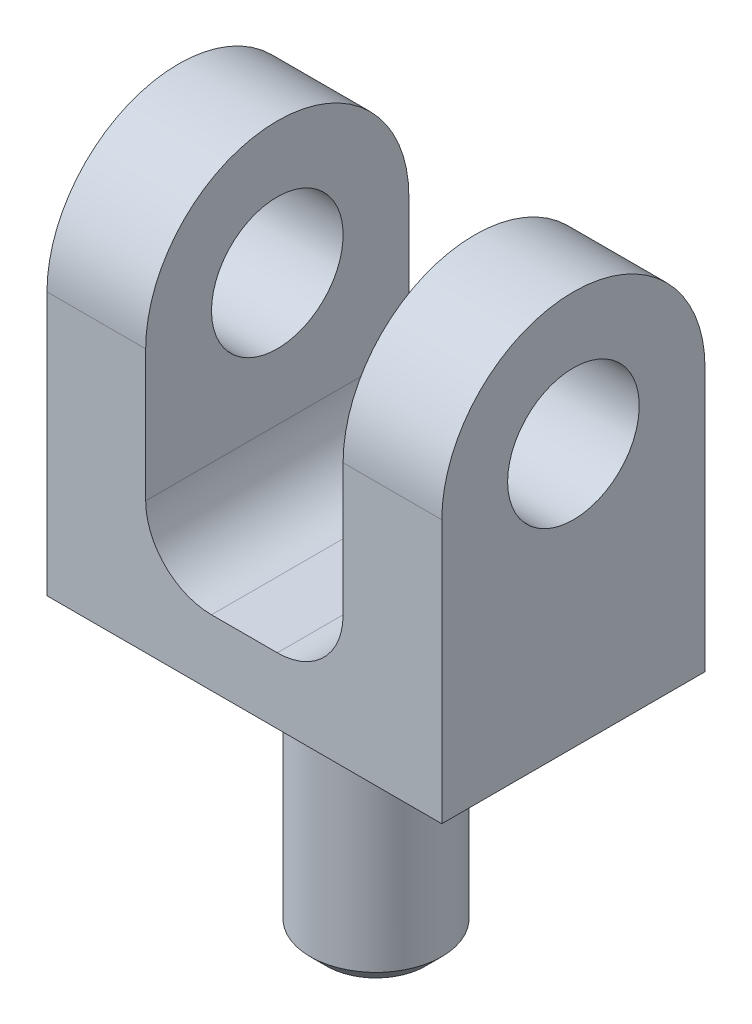
ISO-10303-21;
HEADER;
FILE_DESCRIPTION(('STEP AP214'),'2;1');
FILE_NAME('part.step','',(''),(''),'','','');
FILE_SCHEMA(('AUTOMOTIVE_DESIGN { 1 0 10303 214 1 1 1 1 }'));
ENDSEC;
DATA;
#1=APPLICATION_CONTEXT('core data for automotive mechanical design processes');
#2=APPLICATION_PROTOCOL_DEFINITION('international standard','automotive_design',2000,#1);
#3=PRODUCT_CONTEXT('',#1,'mechanical');
#4=PRODUCT('Part','Part','',(#3));
#5=PRODUCT_RELATED_PRODUCT_CATEGORY('part','',(#4));
#6=PRODUCT_DEFINITION_FORMATION('','',#4);
#7=PRODUCT_DEFINITION_CONTEXT('part definition',#1,'design');
#8=PRODUCT_DEFINITION('design','',#6,#7);
#9=PRODUCT_DEFINITION_SHAPE('','',#8);
#10=(LENGTH_UNIT() NAMED_UNIT(*) SI_UNIT(.MILLI.,.METRE.));
#11=(NAMED_UNIT(*) PLANE_ANGLE_UNIT() SI_UNIT($,.RADIAN.));
#12=(NAMED_UNIT(*) SI_UNIT($,.STERADIAN.) SOLID_ANGLE_UNIT());
#13=UNCERTAINTY_MEASURE_WITH_UNIT(LENGTH_MEASURE(1.E-05),#10,'distance_accuracy_value','');
#14=(GEOMETRIC_REPRESENTATION_CONTEXT(3) GLOBAL_UNCERTAINTY_ASSIGNED_CONTEXT((#13)) GLOBAL_UNIT_ASSIGNED_CONTEXT((#10,
#11,#12)) REPRESENTATION_CONTEXT('',''));
#15=CARTESIAN_POINT('',(0.,0.,0.));
#16=DIRECTION('',(0.,0.,1.));
#17=DIRECTION('',(1.,0.,0.));
#18=AXIS2_PLACEMENT_3D('',#15,#16,#17);
#19=CARTESIAN_POINT('',(9.525,0.,0.));
#20=DIRECTION('',(-1.,0.,0.));
#21=DIRECTION('',(0.,0.,1.));
#22=AXIS2_PLACEMENT_3D('',#19,#20,#21);
#23=CYLINDRICAL_SURFACE('',#22,6.35);
#24=DIRECTION('',(-1.,0.,0.));
#25=VECTOR('',#24,1.);
#26=CARTESIAN_POINT('',(9.525,0.,6.35));
#27=LINE('',#26,#25);
#28=CARTESIAN_POINT('',(-4.7625,0.,6.35));
#29=VERTEX_POINT('',#28);
#30=CARTESIAN_POINT('',(-9.525,0.,6.35));
#31=VERTEX_POINT('',#30);
#32=EDGE_CURVE('E136',#29,#31,#27,.T.);
#33=ORIENTED_EDGE('',*,*,#32,.F.);
#34=CARTESIAN_POINT('',(-4.7625,0.,0.));
#35=DIRECTION('',(-1.,0.,0.));
#36=DIRECTION('',(0.,0.,1.));
#37=AXIS2_PLACEMENT_3D('',#34,#35,#36);
#38=CIRCLE('',#37,6.35);
#39=CARTESIAN_POINT('',(-4.7625,0.,-6.35));
#40=VERTEX_POINT('',#39);
#41=EDGE_CURVE('E156',#29,#40,#38,.T.);
#42=ORIENTED_EDGE('',*,*,#41,.T.);
#43=DIRECTION('',(-1.,0.,0.));
#44=VECTOR('',#43,1.);
#45=CARTESIAN_POINT('',(9.525,0.,-6.35));
#46=LINE('',#45,#44);
#47=CARTESIAN_POINT('',(-9.525,0.,-6.35));
#48=VERTEX_POINT('',#47);
#49=EDGE_CURVE('E273',#40,#48,#46,.T.);
#50=ORIENTED_EDGE('',*,*,#49,.T.);
#51=CARTESIAN_POINT('',(-9.525,0.,0.));
#52=DIRECTION('',(1.,0.,0.));
#53=DIRECTION('',(0.,0.,1.));
#54=AXIS2_PLACEMENT_3D('',#51,#52,#53);
#55=CIRCLE('',#54,6.35);
#56=EDGE_CURVE('E256',#48,#31,#55,.T.);
#57=ORIENTED_EDGE('',*,*,#56,.T.);
#58=EDGE_LOOP('',(#33,#42,#50,#57));
#59=FACE_BOUND('',#58,.T.);
#60=ADVANCED_FACE('F33',(#59),#23,.T.);
#61=CARTESIAN_POINT('',(9.525,0.,0.));
#62=DIRECTION('',(-1.,0.,0.));
#63=DIRECTION('',(0.,0.,1.));
#64=AXIS2_PLACEMENT_3D('',#61,#62,#63);
#65=CYLINDRICAL_SURFACE('',#64,3.175);
#66=CARTESIAN_POINT('',(-4.7625,0.,0.));
#67=DIRECTION('',(-1.,0.,0.));
#68=DIRECTION('',(0.,0.,1.));
#69=AXIS2_PLACEMENT_3D('',#66,#67,#68);
#70=CIRCLE('',#69,3.175);
#71=CARTESIAN_POINT('',(-4.7625,0.,3.175));
#72=VERTEX_POINT('',#71);
#73=EDGE_CURVE('E127',#72,#72,#70,.T.);
#74=CARTESIAN_POINT('',(-9.525,0.,0.));
#75=DIRECTION('',(1.,0.,0.));
#76=DIRECTION('',(0.,0.,-1.));
#77=AXIS2_PLACEMENT_3D('',#74,#75,#76);
#78=CIRCLE('',#77,3.175);
#79=CARTESIAN_POINT('',(-9.525,0.,3.175));
#80=VERTEX_POINT('',#79);
#81=EDGE_CURVE('E257',#80,#80,#78,.T.);
#82=CARTESIAN_POINT('',(-4.7625,0.,3.175));
#83=CARTESIAN_POINT('',(-4.812109375,0.,3.175));
#84=CARTESIAN_POINT('',(-4.86171875,0.,3.175));
#85=CARTESIAN_POINT('',(-4.9609375,0.,3.175));
#86=CARTESIAN_POINT('',(-5.010546875,0.,3.175));
#87=CARTESIAN_POINT('',(-5.109765625,0.,3.175));
#88=CARTESIAN_POINT('',(-5.159375,0.,3.175));
#89=CARTESIAN_POINT('',(-5.25859375,0.,3.175));
#90=CARTESIAN_POINT('',(-5.308203125,0.,3.175));
#91=CARTESIAN_POINT('',(-5.407421875,0.,3.175));
#92=CARTESIAN_POINT('',(-5.45703125,0.,3.175));
#93=CARTESIAN_POINT('',(-5.55625,0.,3.175));
#94=CARTESIAN_POINT('',(-5.605859375,0.,3.175));
#95=CARTESIAN_POINT('',(-5.705078125,0.,3.175));
#96=CARTESIAN_POINT('',(-5.7546875,0.,3.175));
#97=CARTESIAN_POINT('',(-5.85390625,0.,3.175));
#98=CARTESIAN_POINT('',(-5.903515625,0.,3.175));
#99=CARTESIAN_POINT('',(-6.002734375,0.,3.175));
#100=CARTESIAN_POINT('',(-6.05234375,0.,3.175));
#101=CARTESIAN_POINT('',(-6.1515625,0.,3.175));
#102=CARTESIAN_POINT('',(-6.201171875,0.,3.175));
#103=CARTESIAN_POINT('',(-6.300390625,0.,3.175));
#104=CARTESIAN_POINT('',(-6.35,0.,3.175));
#105=CARTESIAN_POINT('',(-6.44921875,0.,3.175));
#106=CARTESIAN_POINT('',(-6.498828125,0.,3.175));
#107=CARTESIAN_POINT('',(-6.598046875,0.,3.175));
#108=CARTESIAN_POINT('',(-6.64765625,0.,3.175));
#109=CARTESIAN_POINT('',(-6.746875,0.,3.175));
#110=CARTESIAN_POINT('',(-6.796484375,0.,3.175));
#111=CARTESIAN_POINT('',(-6.895703125,0.,3.175));
#112=CARTESIAN_POINT('',(-6.9453125,0.,3.175));
#113=CARTESIAN_POINT('',(-7.04453125,0.,3.175));
#114=CARTESIAN_POINT('',(-7.094140625,0.,3.175));
#115=CARTESIAN_POINT('',(-7.193359375,0.,3.175));
#116=CARTESIAN_POINT('',(-7.24296875,0.,3.175));
#117=CARTESIAN_POINT('',(-7.3421875,0.,3.175));
#118=CARTESIAN_POINT('',(-7.391796875,0.,3.175));
#119=CARTESIAN_POINT('',(-7.491015625,0.,3.175));
#120=CARTESIAN_POINT('',(-7.540625,0.,3.175));
#121=CARTESIAN_POINT('',(-7.63984375,0.,3.175));
#122=CARTESIAN_POINT('',(-7.689453125,0.,3.175));
#123=CARTESIAN_POINT('',(-7.788671875,0.,3.175));
#124=CARTESIAN_POINT('',(-7.83828125,0.,3.175));
#125=CARTESIAN_POINT('',(-7.9375,0.,3.175));
#126=CARTESIAN_POINT('',(-7.987109375,0.,3.175));
#127=CARTESIAN_POINT('',(-8.086328125,0.,3.175));
#128=CARTESIAN_POINT('',(-8.1359375,0.,3.175));
#129=CARTESIAN_POINT('',(-8.23515625,0.,3.175));
#130=CARTESIAN_POINT('',(-8.284765625,0.,3.175));
#131=CARTESIAN_POINT('',(-8.383984375,0.,3.175));
#132=CARTESIAN_POINT('',(-8.43359375,0.,3.175));
#133=CARTESIAN_POINT('',(-8.5328125,0.,3.175));
#134=CARTESIAN_POINT('',(-8.582421875,0.,3.175));
#135=CARTESIAN_POINT('',(-8.681640625,0.,3.175));
#136=CARTESIAN_POINT('',(-8.73125,0.,3.175));
#137=CARTESIAN_POINT('',(-8.83046875,0.,3.175));
#138=CARTESIAN_POINT('',(-8.880078125,0.,3.175));
#139=CARTESIAN_POINT('',(-8.979296875,0.,3.175));
#140=CARTESIAN_POINT('',(-9.02890625,0.,3.175));
#141=CARTESIAN_POINT('',(-9.128125,0.,3.175));
#142=CARTESIAN_POINT('',(-9.177734375,0.,3.175));
#143=CARTESIAN_POINT('',(-9.276953125,0.,3.175));
#144=CARTESIAN_POINT('',(-9.3265625,0.,3.175));
#145=CARTESIAN_POINT('',(-9.42578125,0.,3.175));
#146=CARTESIAN_POINT('',(-9.475390625,0.,3.175));
#147=CARTESIAN_POINT('',(-9.525,0.,3.175));
#148=B_SPLINE_CURVE_WITH_KNOTS('',3,(#82,#83,#84,#85,#86,#87,#88,#89,#90,#91,#92,#93,#94,#95,
#96,#97,#98,#99,#100,#101,#102,#103,#104,#105,#106,#107,#108,#109,#110,#111,#112,#113,#114,#115,
#116,#117,#118,#119,#120,#121,#122,#123,#124,#125,#126,#127,#128,#129,#130,#131,#132,#133,#134,
#135,#136,#137,#138,#139,#140,#141,#142,#143,#144,#145,#146,#147),.UNSPECIFIED.,.F.,.F.,(4,2,2,
2,2,2,2,2,2,2,2,2,2,2,2,2,2,2,2,2,2,2,2,2,2,2,2,2,2,2,2,2,4),(0.,0.148828125,0.29765625,
0.446484375,0.5953125,0.744140625,0.892968750000001,1.041796875,1.190625,1.339453125,1.48828125,
1.637109375,1.7859375,1.934765625,2.08359375,2.232421875,2.38125,2.530078125,2.67890625,
2.827734375,2.9765625,3.125390625,3.27421875,3.423046875,3.571875,3.720703125,3.86953125,
4.018359375,4.1671875,4.316015625,4.46484375,4.613671875,4.7625),.UNSPECIFIED.);
#149=EDGE_CURVE('BSEAM181',#72,#80,#148,.T.);
#150=ORIENTED_EDGE('',*,*,#73,.F.);
#151=ORIENTED_EDGE('',*,*,#81,.F.);
#152=ORIENTED_EDGE('',*,*,#149,.T.);
#153=ORIENTED_EDGE('',*,*,#149,.F.);
#154=EDGE_LOOP('',(#150,#152,#151,#153));
#155=FACE_BOUND('',#154,.T.);
#156=ADVANCED_FACE('F181',(#155),#65,.F.);
#157=CARTESIAN_POINT('',(9.525,-12.7,6.35));
#158=DIRECTION('',(0.,1.,0.));
#159=DIRECTION('',(0.,0.,1.));
#160=AXIS2_PLACEMENT_3D('',#157,#158,#159);
#161=PLANE('',#160);
#162=DIRECTION('',(0.,0.,-1.));
#163=VECTOR('',#162,1.);
#164=CARTESIAN_POINT('',(-9.525,-12.7,6.35));
#165=LINE('',#164,#163);
#166=CARTESIAN_POINT('',(-9.525,-12.7,6.35));
#167=VERTEX_POINT('',#166);
#168=CARTESIAN_POINT('',(-9.525,-12.7,-6.35));
#169=VERTEX_POINT('',#168);
#170=EDGE_CURVE('E222',#167,#169,#165,.T.);
#171=ORIENTED_EDGE('',*,*,#170,.T.);
#172=DIRECTION('',(-1.,0.,0.));
#173=VECTOR('',#172,1.);
#174=CARTESIAN_POINT('',(9.525,-12.7,-6.35));
#175=LINE('',#174,#173);
#176=CARTESIAN_POINT('',(9.525,-12.7,-6.35));
#177=VERTEX_POINT('',#176);
#178=EDGE_CURVE('E279',#177,#169,#175,.T.);
#179=ORIENTED_EDGE('',*,*,#178,.F.);
#180=DIRECTION('',(0.,0.,-1.));
#181=VECTOR('',#180,1.);
#182=CARTESIAN_POINT('',(9.525,-12.7,6.35));
#183=LINE('',#182,#181);
#184=CARTESIAN_POINT('',(9.525,-12.7,6.35));
#185=VERTEX_POINT('',#184);
#186=EDGE_CURVE('E270',#185,#177,#183,.T.);
#187=ORIENTED_EDGE('',*,*,#186,.F.);
#188=DIRECTION('',(-1.,0.,0.));
#189=VECTOR('',#188,1.);
#190=CARTESIAN_POINT('',(9.525,-12.7,6.35));
#191=LINE('',#190,#189);
#192=EDGE_CURVE('E141',#185,#167,#191,.T.);
#193=ORIENTED_EDGE('',*,*,#192,.T.);
#194=EDGE_LOOP('',(#171,#179,#187,#193));
#195=FACE_BOUND('',#194,.T.);
#196=CARTESIAN_POINT('',(0.,-12.7,0.));
#197=DIRECTION('',(0.,1.,0.));
#198=DIRECTION('',(0.,0.,1.));
#199=AXIS2_PLACEMENT_3D('',#196,#197,#198);
#200=CIRCLE('',#199,3.175);
#201=CARTESIAN_POINT('',(0.,-12.7,3.175));
#202=VERTEX_POINT('',#201);
#203=EDGE_CURVE('E135',#202,#202,#200,.F.);
#204=ORIENTED_EDGE('',*,*,#203,.F.);
#205=EDGE_LOOP('',(#204));
#206=FACE_BOUND('',#205,.T.);
#207=ADVANCED_FACE('F187',(#195,#206),#161,.F.);
#208=CARTESIAN_POINT('',(9.525,0.,0.));
#209=DIRECTION('',(-1.,0.,0.));
#210=DIRECTION('',(0.,0.,1.));
#211=AXIS2_PLACEMENT_3D('',#208,#209,#210);
#212=PLANE('',#211);
#213=CARTESIAN_POINT('',(9.525,0.,0.));
#214=DIRECTION('',(1.,0.,0.));
#215=DIRECTION('',(0.,0.,1.));
#216=AXIS2_PLACEMENT_3D('',#213,#214,#215);
#217=CIRCLE('',#216,6.35);
#218=CARTESIAN_POINT('',(9.525,0.,-6.35));
#219=VERTEX_POINT('',#218);
#220=CARTESIAN_POINT('',(9.525,0.,6.35));
#221=VERTEX_POINT('',#220);
#222=EDGE_CURVE('E266',#219,#221,#217,.T.);
#223=ORIENTED_EDGE('',*,*,#222,.T.);
#224=DIRECTION('',(0.,-1.,0.));
#225=VECTOR('',#224,1.);
#226=CARTESIAN_POINT('',(9.525,0.,6.35));
#227=LINE('',#226,#225);
#228=EDGE_CURVE('E133',#221,#185,#227,.T.);
#229=ORIENTED_EDGE('',*,*,#228,.T.);
#230=ORIENTED_EDGE('',*,*,#186,.T.);
#231=DIRECTION('',(0.,1.,0.));
#232=VECTOR('',#231,1.);
#233=CARTESIAN_POINT('',(9.525,-12.7,-6.35));
#234=LINE('',#233,#232);
#235=EDGE_CURVE('E272',#177,#219,#234,.T.);
#236=ORIENTED_EDGE('',*,*,#235,.T.);
#237=EDGE_LOOP('',(#223,#229,#230,#236));
#238=FACE_BOUND('',#237,.T.);
#239=CARTESIAN_POINT('',(9.525,0.,0.));
#240=DIRECTION('',(1.,0.,0.));
#241=DIRECTION('',(0.,0.,-1.));
#242=AXIS2_PLACEMENT_3D('',#239,#240,#241);
#243=CIRCLE('',#242,3.175);
#244=CARTESIAN_POINT('',(9.525,0.,3.175));
#245=VERTEX_POINT('',#244);
#246=EDGE_CURVE('E254',#245,#245,#243,.T.);
#247=ORIENTED_EDGE('',*,*,#246,.F.);
#248=EDGE_LOOP('',(#247));
#249=FACE_BOUND('',#248,.T.);
#250=ADVANCED_FACE('F201',(#238,#249),#212,.F.);
#251=CARTESIAN_POINT('',(-9.525,0.,0.));
#252=DIRECTION('',(-1.,0.,0.));
#253=DIRECTION('',(0.,0.,1.));
#254=AXIS2_PLACEMENT_3D('',#251,#252,#253);
#255=PLANE('',#254);
#256=ORIENTED_EDGE('',*,*,#56,.F.);
#257=DIRECTION('',(0.,1.,0.));
#258=VECTOR('',#257,1.);
#259=CARTESIAN_POINT('',(-9.525,-12.7,-6.35));
#260=LINE('',#259,#258);
#261=EDGE_CURVE('E268',#169,#48,#260,.T.);
#262=ORIENTED_EDGE('',*,*,#261,.F.);
#263=ORIENTED_EDGE('',*,*,#170,.F.);
#264=DIRECTION('',(0.,-1.,0.));
#265=VECTOR('',#264,1.);
#266=CARTESIAN_POINT('',(-9.525,0.,6.35));
#267=LINE('',#266,#265);
#268=EDGE_CURVE('E260',#31,#167,#267,.T.);
#269=ORIENTED_EDGE('',*,*,#268,.F.);
#270=EDGE_LOOP('',(#256,#262,#263,#269));
#271=FACE_BOUND('',#270,.T.);
#272=ORIENTED_EDGE('',*,*,#81,.T.);
#273=EDGE_LOOP('',(#272));
#274=FACE_BOUND('',#273,.T.);
#275=ADVANCED_FACE('F195',(#271,#274),#255,.T.);
#276=CARTESIAN_POINT('',(4.7625,0.,-6.35));
#277=VERTEX_POINT('',#276);
#278=EDGE_CURVE('E126',#219,#277,#46,.T.);
#279=ORIENTED_EDGE('',*,*,#278,.T.);
#280=CARTESIAN_POINT('',(4.7625,0.,0.));
#281=DIRECTION('',(1.,0.,0.));
#282=DIRECTION('',(0.,0.,-1.));
#283=AXIS2_PLACEMENT_3D('',#280,#281,#282);
#284=CIRCLE('',#283,6.35);
#285=CARTESIAN_POINT('',(4.7625,0.,6.35));
#286=VERTEX_POINT('',#285);
#287=EDGE_CURVE('E112',#277,#286,#284,.T.);
#288=ORIENTED_EDGE('',*,*,#287,.T.);
#289=EDGE_CURVE('E124',#221,#286,#27,.T.);
#290=ORIENTED_EDGE('',*,*,#289,.F.);
#291=ORIENTED_EDGE('',*,*,#222,.F.);
#292=EDGE_LOOP('',(#279,#288,#290,#291));
#293=FACE_BOUND('',#292,.T.);
#294=ADVANCED_FACE('F122',(#293),#23,.T.);
#295=CARTESIAN_POINT('',(9.525,0.,6.35));
#296=DIRECTION('',(0.,0.,-1.));
#297=DIRECTION('',(0.,1.,0.));
#298=AXIS2_PLACEMENT_3D('',#295,#296,#297);
#299=PLANE('',#298);
#300=DIRECTION('',(1.,0.,0.));
#301=VECTOR('',#300,1.);
#302=CARTESIAN_POINT('',(-4.7625,-9.525,6.35));
#303=LINE('',#302,#301);
#304=CARTESIAN_POINT('',(-1.5875,-9.525,6.35));
#305=VERTEX_POINT('',#304);
#306=CARTESIAN_POINT('',(1.5875,-9.525,6.35));
#307=VERTEX_POINT('',#306);
#308=EDGE_CURVE('E118',#305,#307,#303,.T.);
#309=ORIENTED_EDGE('',*,*,#308,.F.);
#310=CARTESIAN_POINT('',(-1.5875,-6.35,6.35));
#311=DIRECTION('',(0.,0.,-1.));
#312=DIRECTION('',(0.,1.,0.));
#313=AXIS2_PLACEMENT_3D('',#310,#311,#312);
#314=CIRCLE('',#313,3.175);
#315=CARTESIAN_POINT('',(-4.7625,-6.35,6.35));
#316=VERTEX_POINT('',#315);
#317=EDGE_CURVE('E164',#305,#316,#314,.T.);
#318=ORIENTED_EDGE('',*,*,#317,.T.);
#319=DIRECTION('',(0.,-1.,0.));
#320=VECTOR('',#319,1.);
#321=CARTESIAN_POINT('',(-4.7625,-9.525,6.35));
#322=LINE('',#321,#320);
#323=EDGE_CURVE('E172',#29,#316,#322,.T.);
#324=ORIENTED_EDGE('',*,*,#323,.F.);
#325=ORIENTED_EDGE('',*,*,#32,.T.);
#326=ORIENTED_EDGE('',*,*,#268,.T.);
#327=ORIENTED_EDGE('',*,*,#192,.F.);
#328=ORIENTED_EDGE('',*,*,#228,.F.);
#329=ORIENTED_EDGE('',*,*,#289,.T.);
#330=DIRECTION('',(0.,1.,0.));
#331=VECTOR('',#330,1.);
#332=CARTESIAN_POINT('',(4.7625,-9.525,6.35));
#333=LINE('',#332,#331);
#334=CARTESIAN_POINT('',(4.7625,-6.35,6.35));
#335=VERTEX_POINT('',#334);
#336=EDGE_CURVE('E109',#335,#286,#333,.T.);
#337=ORIENTED_EDGE('',*,*,#336,.F.);
#338=CARTESIAN_POINT('',(1.5875,-6.35,6.35));
#339=DIRECTION('',(0.,0.,-1.));
#340=DIRECTION('',(0.,1.,0.));
#341=AXIS2_PLACEMENT_3D('',#338,#339,#340);
#342=CIRCLE('',#341,3.175);
#343=EDGE_CURVE('E41',#335,#307,#342,.T.);
#344=ORIENTED_EDGE('',*,*,#343,.T.);
#345=EDGE_LOOP('',(#309,#318,#324,#325,#326,#327,#328,#329,#337,#344));
#346=FACE_BOUND('',#345,.T.);
#347=ADVANCED_FACE('F131',(#346),#299,.F.);
#348=CARTESIAN_POINT('',(9.525,-12.7,-6.35));
#349=DIRECTION('',(0.,0.,1.));
#350=DIRECTION('',(0.,-1.,0.));
#351=AXIS2_PLACEMENT_3D('',#348,#349,#350);
#352=PLANE('',#351);
#353=ORIENTED_EDGE('',*,*,#49,.F.);
#354=DIRECTION('',(0.,-1.,0.));
#355=VECTOR('',#354,1.);
#356=CARTESIAN_POINT('',(-4.7625,-9.525,-6.35));
#357=LINE('',#356,#355);
#358=CARTESIAN_POINT('',(-4.7625,-6.35,-6.35));
#359=VERTEX_POINT('',#358);
#360=EDGE_CURVE('E117',#40,#359,#357,.T.);
#361=ORIENTED_EDGE('',*,*,#360,.T.);
#362=CARTESIAN_POINT('',(-1.5875,-6.35,-6.35));
#363=DIRECTION('',(0.,0.,1.));
#364=DIRECTION('',(0.,-1.,0.));
#365=AXIS2_PLACEMENT_3D('',#362,#363,#364);
#366=CIRCLE('',#365,3.175);
#367=CARTESIAN_POINT('',(-1.5875,-9.525,-6.35));
#368=VERTEX_POINT('',#367);
#369=EDGE_CURVE('E166',#359,#368,#366,.T.);
#370=ORIENTED_EDGE('',*,*,#369,.T.);
#371=DIRECTION('',(1.,0.,0.));
#372=VECTOR('',#371,1.);
#373=CARTESIAN_POINT('',(-4.7625,-9.525,-6.35));
#374=LINE('',#373,#372);
#375=CARTESIAN_POINT('',(1.5875,-9.525,-6.35));
#376=VERTEX_POINT('',#375);
#377=EDGE_CURVE('E292',#368,#376,#374,.T.);
#378=ORIENTED_EDGE('',*,*,#377,.T.);
#379=CARTESIAN_POINT('',(1.5875,-6.35,-6.35));
#380=DIRECTION('',(0.,0.,1.));
#381=DIRECTION('',(0.,-1.,0.));
#382=AXIS2_PLACEMENT_3D('',#379,#380,#381);
#383=CIRCLE('',#382,3.175);
#384=CARTESIAN_POINT('',(4.7625,-6.35,-6.35));
#385=VERTEX_POINT('',#384);
#386=EDGE_CURVE('E11',#376,#385,#383,.T.);
#387=ORIENTED_EDGE('',*,*,#386,.T.);
#388=DIRECTION('',(0.,1.,0.));
#389=VECTOR('',#388,1.);
#390=CARTESIAN_POINT('',(4.7625,-9.525,-6.35));
#391=LINE('',#390,#389);
#392=EDGE_CURVE('E153',#385,#277,#391,.T.);
#393=ORIENTED_EDGE('',*,*,#392,.T.);
#394=ORIENTED_EDGE('',*,*,#278,.F.);
#395=ORIENTED_EDGE('',*,*,#235,.F.);
#396=ORIENTED_EDGE('',*,*,#178,.T.);
#397=ORIENTED_EDGE('',*,*,#261,.T.);
#398=EDGE_LOOP('',(#353,#361,#370,#378,#387,#393,#394,#395,#396,#397));
#399=FACE_BOUND('',#398,.T.);
#400=ADVANCED_FACE('F200',(#399),#352,.F.);
#401=CARTESIAN_POINT('',(4.7625,0.,0.));
#402=DIRECTION('',(1.,0.,0.));
#403=DIRECTION('',(0.,0.,-1.));
#404=AXIS2_PLACEMENT_3D('',#401,#402,#403);
#405=CIRCLE('',#404,3.175);
#406=CARTESIAN_POINT('',(4.7625,0.,3.175));
#407=VERTEX_POINT('',#406);
#408=EDGE_CURVE('E128',#407,#407,#405,.T.);
#409=CARTESIAN_POINT('',(4.7625,0.,3.175));
#410=CARTESIAN_POINT('',(4.812109375,0.,3.175));
#411=CARTESIAN_POINT('',(4.86171875,0.,3.175));
#412=CARTESIAN_POINT('',(4.9609375,0.,3.175));
#413=CARTESIAN_POINT('',(5.010546875,0.,3.175));
#414=CARTESIAN_POINT('',(5.109765625,0.,3.175));
#415=CARTESIAN_POINT('',(5.159375,0.,3.175));
#416=CARTESIAN_POINT('',(5.25859375,0.,3.175));
#417=CARTESIAN_POINT('',(5.308203125,0.,3.175));
#418=CARTESIAN_POINT('',(5.407421875,0.,3.175));
#419=CARTESIAN_POINT('',(5.45703125,0.,3.175));
#420=CARTESIAN_POINT('',(5.55625,0.,3.175));
#421=CARTESIAN_POINT('',(5.605859375,0.,3.175));
#422=CARTESIAN_POINT('',(5.705078125,0.,3.175));
#423=CARTESIAN_POINT('',(5.7546875,0.,3.175));
#424=CARTESIAN_POINT('',(5.85390625,0.,3.175));
#425=CARTESIAN_POINT('',(5.903515625,0.,3.175));
#426=CARTESIAN_POINT('',(6.002734375,0.,3.175));
#427=CARTESIAN_POINT('',(6.05234375,0.,3.175));
#428=CARTESIAN_POINT('',(6.1515625,0.,3.175));
#429=CARTESIAN_POINT('',(6.201171875,0.,3.175));
#430=CARTESIAN_POINT('',(6.300390625,0.,3.175));
#431=CARTESIAN_POINT('',(6.35,0.,3.175));
#432=CARTESIAN_POINT('',(6.44921875,0.,3.175));
#433=CARTESIAN_POINT('',(6.498828125,0.,3.175));
#434=CARTESIAN_POINT('',(6.598046875,0.,3.175));
#435=CARTESIAN_POINT('',(6.64765625,0.,3.175));
#436=CARTESIAN_POINT('',(6.746875,0.,3.175));
#437=CARTESIAN_POINT('',(6.796484375,0.,3.175));
#438=CARTESIAN_POINT('',(6.895703125,0.,3.175));
#439=CARTESIAN_POINT('',(6.9453125,0.,3.175));
#440=CARTESIAN_POINT('',(7.04453125,0.,3.175));
#441=CARTESIAN_POINT('',(7.094140625,0.,3.175));
#442=CARTESIAN_POINT('',(7.193359375,0.,3.175));
#443=CARTESIAN_POINT('',(7.24296875,0.,3.175));
#444=CARTESIAN_POINT('',(7.3421875,0.,3.175));
#445=CARTESIAN_POINT('',(7.391796875,0.,3.175));
#446=CARTESIAN_POINT('',(7.491015625,0.,3.175));
#447=CARTESIAN_POINT('',(7.540625,0.,3.175));
#448=CARTESIAN_POINT('',(7.63984375,0.,3.175));
#449=CARTESIAN_POINT('',(7.689453125,0.,3.175));
#450=CARTESIAN_POINT('',(7.788671875,0.,3.175));
#451=CARTESIAN_POINT('',(7.83828125,0.,3.175));
#452=CARTESIAN_POINT('',(7.9375,0.,3.175));
#453=CARTESIAN_POINT('',(7.987109375,0.,3.175));
#454=CARTESIAN_POINT('',(8.086328125,0.,3.175));
#455=CARTESIAN_POINT('',(8.1359375,0.,3.175));
#456=CARTESIAN_POINT('',(8.23515625,0.,3.175));
#457=CARTESIAN_POINT('',(8.284765625,0.,3.175));
#458=CARTESIAN_POINT('',(8.383984375,0.,3.175));
#459=CARTESIAN_POINT('',(8.43359375,0.,3.175));
#460=CARTESIAN_POINT('',(8.5328125,0.,3.175));
#461=CARTESIAN_POINT('',(8.582421875,0.,3.175));
#462=CARTESIAN_POINT('',(8.681640625,0.,3.175));
#463=CARTESIAN_POINT('',(8.73125,0.,3.175));
#464=CARTESIAN_POINT('',(8.83046875,0.,3.175));
#465=CARTESIAN_POINT('',(8.880078125,0.,3.175));
#466=CARTESIAN_POINT('',(8.979296875,0.,3.175));
#467=CARTESIAN_POINT('',(9.02890625,0.,3.175));
#468=CARTESIAN_POINT('',(9.128125,0.,3.175));
#469=CARTESIAN_POINT('',(9.177734375,0.,3.175));
#470=CARTESIAN_POINT('',(9.276953125,0.,3.175));
#471=CARTESIAN_POINT('',(9.3265625,0.,3.175));
#472=CARTESIAN_POINT('',(9.42578125,0.,3.175));
#473=CARTESIAN_POINT('',(9.475390625,0.,3.175));
#474=CARTESIAN_POINT('',(9.525,0.,3.175));
#475=B_SPLINE_CURVE_WITH_KNOTS('',3,(#409,#410,#411,#412,#413,#414,#415,#416,#417,#418,#419,
#420,#421,#422,#423,#424,#425,#426,#427,#428,#429,#430,#431,#432,#433,#434,#435,#436,#437,#438,
#439,#440,#441,#442,#443,#444,#445,#446,#447,#448,#449,#450,#451,#452,#453,#454,#455,#456,#457,
#458,#459,#460,#461,#462,#463,#464,#465,#466,#467,#468,#469,#470,#471,#472,#473,#474),
.UNSPECIFIED.,.F.,.F.,(4,2,2,2,2,2,2,2,2,2,2,2,2,2,2,2,2,2,2,2,2,2,2,2,2,2,2,2,2,2,2,2,4),(0.,
0.148828125,0.29765625,0.446484375,0.5953125,0.744140625,0.89296875,1.041796875,1.190625,
1.339453125,1.48828125,1.637109375,1.7859375,1.934765625,2.08359375,2.232421875,2.38125,
2.530078125,2.67890625,2.827734375,2.9765625,3.125390625,3.27421875,3.423046875,3.571875,
3.720703125,3.86953125,4.018359375,4.1671875,4.316015625,4.46484375,4.613671875,4.7625),.UNSPECIFIED.);
#476=EDGE_CURVE('BSEAM190',#407,#245,#475,.T.);
#477=ORIENTED_EDGE('',*,*,#408,.F.);
#478=ORIENTED_EDGE('',*,*,#246,.T.);
#479=ORIENTED_EDGE('',*,*,#476,.T.);
#480=ORIENTED_EDGE('',*,*,#476,.F.);
#481=EDGE_LOOP('',(#477,#479,#478,#480));
#482=FACE_BOUND('',#481,.T.);
#483=ADVANCED_FACE('F190',(#482),#65,.F.);
#484=CARTESIAN_POINT('',(0.,-25.4,0.));
#485=DIRECTION('',(0.,1.,0.));
#486=DIRECTION('',(0.,0.,1.));
#487=AXIS2_PLACEMENT_3D('',#484,#485,#486);
#488=CYLINDRICAL_SURFACE('',#487,3.175);
#489=CARTESIAN_POINT('',(0.,-24.60625,0.));
#490=DIRECTION('',(0.,-1.,0.));
#491=DIRECTION('',(0.,0.,-1.));
#492=AXIS2_PLACEMENT_3D('',#489,#490,#491);
#493=CIRCLE('',#492,3.175);
#494=CARTESIAN_POINT('',(0.,-24.60625,-3.175));
#495=VERTEX_POINT('',#494);
#496=EDGE_CURVE('E147',#495,#495,#493,.F.);
#497=ORIENTED_EDGE('',*,*,#496,.T.);
#498=EDGE_LOOP('',(#497));
#499=FACE_BOUND('',#498,.T.);
#500=ORIENTED_EDGE('',*,*,#203,.T.);
#501=EDGE_LOOP('',(#500));
#502=FACE_BOUND('',#501,.T.);
#503=ADVANCED_FACE('F226',(#499,#502),#488,.T.);
#504=CARTESIAN_POINT('',(0.,-25.4,0.));
#505=DIRECTION('',(0.,-1.,0.));
#506=DIRECTION('',(0.,0.,-1.));
#507=AXIS2_PLACEMENT_3D('',#504,#505,#506);
#508=PLANE('',#507);
#509=CARTESIAN_POINT('',(0.,-25.4,0.));
#510=DIRECTION('',(0.,-1.,0.));
#511=DIRECTION('',(0.,0.,-1.));
#512=AXIS2_PLACEMENT_3D('',#509,#510,#511);
#513=CIRCLE('',#512,2.38125);
#514=CARTESIAN_POINT('',(0.,-25.4,-2.38125000000001));
#515=VERTEX_POINT('',#514);
#516=EDGE_CURVE('E139',#515,#515,#513,.T.);
#517=ORIENTED_EDGE('',*,*,#516,.T.);
#518=EDGE_LOOP('',(#517));
#519=FACE_BOUND('',#518,.T.);
#520=ADVANCED_FACE('F228',(#519),#508,.T.);
#521=CARTESIAN_POINT('',(0.,-25.4,0.));
#522=DIRECTION('',(0.,1.,0.));
#523=DIRECTION('',(0.,0.,1.));
#524=AXIS2_PLACEMENT_3D('',#521,#522,#523);
#525=CONICAL_SURFACE('',#524,2.38125,0.785398163397448);
#526=ORIENTED_EDGE('',*,*,#496,.F.);
#527=EDGE_LOOP('',(#526));
#528=FACE_BOUND('',#527,.T.);
#529=ORIENTED_EDGE('',*,*,#516,.F.);
#530=EDGE_LOOP('',(#529));
#531=FACE_BOUND('',#530,.T.);
#532=ADVANCED_FACE('F235',(#528,#531),#525,.T.);
#533=CARTESIAN_POINT('',(-4.7625,-9.525,-6.35));
#534=DIRECTION('',(-1.,0.,0.));
#535=DIRECTION('',(0.,0.,1.));
#536=AXIS2_PLACEMENT_3D('',#533,#534,#535);
#537=PLANE('',#536);
#538=ORIENTED_EDGE('',*,*,#73,.T.);
#539=EDGE_LOOP('',(#538));
#540=FACE_BOUND('',#539,.T.);
#541=ORIENTED_EDGE('',*,*,#323,.T.);
#542=DIRECTION('',(0.,0.,1.));
#543=VECTOR('',#542,1.);
#544=CARTESIAN_POINT('',(-4.7625,-6.35,-6.35));
#545=LINE('',#544,#543);
#546=EDGE_CURVE('E161',#316,#359,#545,.F.);
#547=ORIENTED_EDGE('',*,*,#546,.T.);
#548=ORIENTED_EDGE('',*,*,#360,.F.);
#549=ORIENTED_EDGE('',*,*,#41,.F.);
#550=EDGE_LOOP('',(#541,#547,#548,#549));
#551=FACE_BOUND('',#550,.T.);
#552=ADVANCED_FACE('F240',(#540,#551),#537,.F.);
#553=CARTESIAN_POINT('',(4.7625,-9.525,-6.35));
#554=DIRECTION('',(1.,0.,0.));
#555=DIRECTION('',(0.,0.,-1.));
#556=AXIS2_PLACEMENT_3D('',#553,#554,#555);
#557=PLANE('',#556);
#558=ORIENTED_EDGE('',*,*,#408,.T.);
#559=EDGE_LOOP('',(#558));
#560=FACE_BOUND('',#559,.T.);
#561=ORIENTED_EDGE('',*,*,#392,.F.);
#562=DIRECTION('',(0.,0.,1.));
#563=VECTOR('',#562,1.);
#564=CARTESIAN_POINT('',(4.7625,-6.35,6.35));
#565=LINE('',#564,#563);
#566=EDGE_CURVE('E114',#385,#335,#565,.T.);
#567=ORIENTED_EDGE('',*,*,#566,.T.);
#568=ORIENTED_EDGE('',*,*,#336,.T.);
#569=ORIENTED_EDGE('',*,*,#287,.F.);
#570=EDGE_LOOP('',(#561,#567,#568,#569));
#571=FACE_BOUND('',#570,.T.);
#572=ADVANCED_FACE('F111',(#560,#571),#557,.F.);
#573=CARTESIAN_POINT('',(-4.7625,-9.525,-6.35));
#574=DIRECTION('',(0.,-1.,0.));
#575=DIRECTION('',(0.,0.,-1.));
#576=AXIS2_PLACEMENT_3D('',#573,#574,#575);
#577=PLANE('',#576);
#578=ORIENTED_EDGE('',*,*,#377,.F.);
#579=DIRECTION('',(0.,0.,1.));
#580=VECTOR('',#579,1.);
#581=CARTESIAN_POINT('',(-1.5875,-9.525,6.35));
#582=LINE('',#581,#580);
#583=EDGE_CURVE('E158',#368,#305,#582,.T.);
#584=ORIENTED_EDGE('',*,*,#583,.T.);
#585=ORIENTED_EDGE('',*,*,#308,.T.);
#586=DIRECTION('',(0.,0.,1.));
#587=VECTOR('',#586,1.);
#588=CARTESIAN_POINT('',(1.5875,-9.525,-6.35));
#589=LINE('',#588,#587);
#590=EDGE_CURVE('E150',#307,#376,#589,.F.);
#591=ORIENTED_EDGE('',*,*,#590,.T.);
#592=EDGE_LOOP('',(#578,#584,#585,#591));
#593=FACE_BOUND('',#592,.T.);
#594=ADVANCED_FACE('F170',(#593),#577,.F.);
#595=CARTESIAN_POINT('',(-1.5875,-6.35,-6.35));
#596=DIRECTION('',(0.,0.,-1.));
#597=DIRECTION('',(-1.,0.,0.));
#598=AXIS2_PLACEMENT_3D('',#595,#596,#597);
#599=CYLINDRICAL_SURFACE('',#598,3.175);
#600=ORIENTED_EDGE('',*,*,#369,.F.);
#601=ORIENTED_EDGE('',*,*,#546,.F.);
#602=ORIENTED_EDGE('',*,*,#317,.F.);
#603=ORIENTED_EDGE('',*,*,#583,.F.);
#604=EDGE_LOOP('',(#600,#601,#602,#603));
#605=FACE_BOUND('',#604,.T.);
#606=ADVANCED_FACE('F175',(#605),#599,.F.);
#607=CARTESIAN_POINT('',(1.5875,-6.35,-6.35));
#608=DIRECTION('',(0.,0.,-1.));
#609=DIRECTION('',(-1.,0.,0.));
#610=AXIS2_PLACEMENT_3D('',#607,#608,#609);
#611=CYLINDRICAL_SURFACE('',#610,3.175);
#612=ORIENTED_EDGE('',*,*,#386,.F.);
#613=ORIENTED_EDGE('',*,*,#590,.F.);
#614=ORIENTED_EDGE('',*,*,#343,.F.);
#615=ORIENTED_EDGE('',*,*,#566,.F.);
#616=EDGE_LOOP('',(#612,#613,#614,#615));
#617=FACE_BOUND('',#616,.T.);
#618=ADVANCED_FACE('F35',(#617),#611,.F.);
#619=CLOSED_SHELL('',(#60,#156,#207,#250,#275,#294,#347,#400,#483,#503,#520,#532,#552,#572,#594,
#606,#618));
#620=MANIFOLD_SOLID_BREP('B2',#619);
#621=ADVANCED_BREP_SHAPE_REPRESENTATION('',(#18,#620),#14);
#622=SHAPE_DEFINITION_REPRESENTATION(#9,#621);
ENDSEC;
END-ISO-10303-21;
